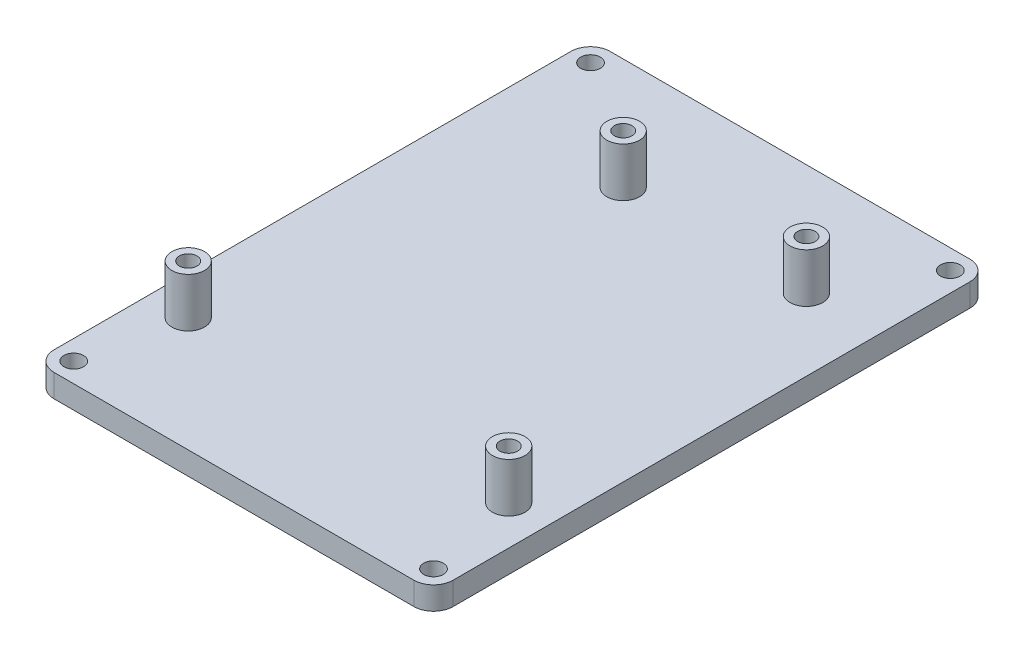
ISO-10303-21;
HEADER;
FILE_DESCRIPTION(('STEP AP214'),'2;1');
FILE_NAME('part.step','',(''),(''),'','','');
FILE_SCHEMA(('AUTOMOTIVE_DESIGN { 1 0 10303 214 1 1 1 1 }'));
ENDSEC;
DATA;
#1=APPLICATION_CONTEXT('core data for automotive mechanical design processes');
#2=APPLICATION_PROTOCOL_DEFINITION('international standard','automotive_design',2000,#1);
#3=PRODUCT_CONTEXT('',#1,'mechanical');
#4=PRODUCT('Part','Part','',(#3));
#5=PRODUCT_RELATED_PRODUCT_CATEGORY('part','',(#4));
#6=PRODUCT_DEFINITION_FORMATION('','',#4);
#7=PRODUCT_DEFINITION_CONTEXT('part definition',#1,'design');
#8=PRODUCT_DEFINITION('design','',#6,#7);
#9=PRODUCT_DEFINITION_SHAPE('','',#8);
#10=(LENGTH_UNIT() NAMED_UNIT(*) SI_UNIT(.MILLI.,.METRE.));
#11=(NAMED_UNIT(*) PLANE_ANGLE_UNIT() SI_UNIT($,.RADIAN.));
#12=(NAMED_UNIT(*) SI_UNIT($,.STERADIAN.) SOLID_ANGLE_UNIT());
#13=UNCERTAINTY_MEASURE_WITH_UNIT(LENGTH_MEASURE(1.E-05),#10,'distance_accuracy_value','');
#14=(GEOMETRIC_REPRESENTATION_CONTEXT(3) GLOBAL_UNCERTAINTY_ASSIGNED_CONTEXT((#13)) GLOBAL_UNIT_ASSIGNED_CONTEXT((#10,
#11,#12)) REPRESENTATION_CONTEXT('',''));
#15=CARTESIAN_POINT('',(0.,0.,0.));
#16=DIRECTION('',(0.,0.,1.));
#17=DIRECTION('',(1.,0.,0.));
#18=AXIS2_PLACEMENT_3D('',#15,#16,#17);
#19=CARTESIAN_POINT('',(30.5,3.5,-42.5));
#20=DIRECTION('',(-1.,0.,0.));
#21=DIRECTION('',(0.,0.,1.));
#22=AXIS2_PLACEMENT_3D('',#19,#20,#21);
#23=PLANE('',#22);
#24=DIRECTION('',(0.,0.,-1.));
#25=VECTOR('',#24,1.);
#26=CARTESIAN_POINT('',(30.5,0.,-42.5));
#27=LINE('',#26,#25);
#28=CARTESIAN_POINT('',(30.5,0.,39.5));
#29=VERTEX_POINT('',#28);
#30=CARTESIAN_POINT('',(30.5,0.,-39.5));
#31=VERTEX_POINT('',#30);
#32=EDGE_CURVE('E128',#29,#31,#27,.T.);
#33=ORIENTED_EDGE('',*,*,#32,.T.);
#34=DIRECTION('',(0.,-1.,0.));
#35=VECTOR('',#34,1.);
#36=CARTESIAN_POINT('',(30.5,3.5,-39.5));
#37=LINE('',#36,#35);
#38=CARTESIAN_POINT('',(30.5,3.5,-39.5));
#39=VERTEX_POINT('',#38);
#40=EDGE_CURVE('E151',#31,#39,#37,.F.);
#41=ORIENTED_EDGE('',*,*,#40,.T.);
#42=DIRECTION('',(0.,0.,-1.));
#43=VECTOR('',#42,1.);
#44=CARTESIAN_POINT('',(30.5,3.5,-42.5));
#45=LINE('',#44,#43);
#46=CARTESIAN_POINT('',(30.5,3.5,39.5));
#47=VERTEX_POINT('',#46);
#48=EDGE_CURVE('E126',#47,#39,#45,.T.);
#49=ORIENTED_EDGE('',*,*,#48,.F.);
#50=DIRECTION('',(0.,-1.,0.));
#51=VECTOR('',#50,1.);
#52=CARTESIAN_POINT('',(30.5,3.5,39.5));
#53=LINE('',#52,#51);
#54=EDGE_CURVE('E148',#47,#29,#53,.T.);
#55=ORIENTED_EDGE('',*,*,#54,.T.);
#56=EDGE_LOOP('',(#33,#41,#49,#55));
#57=FACE_BOUND('',#56,.T.);
#58=ADVANCED_FACE('F33',(#57),#23,.F.);
#59=CARTESIAN_POINT('',(-30.5,3.5,-42.5));
#60=DIRECTION('',(0.,0.,1.));
#61=DIRECTION('',(1.,0.,0.));
#62=AXIS2_PLACEMENT_3D('',#59,#60,#61);
#63=PLANE('',#62);
#64=DIRECTION('',(-1.,0.,0.));
#65=VECTOR('',#64,1.);
#66=CARTESIAN_POINT('',(-30.5,0.,-42.5));
#67=LINE('',#66,#65);
#68=CARTESIAN_POINT('',(27.5,0.,-42.5));
#69=VERTEX_POINT('',#68);
#70=CARTESIAN_POINT('',(-27.5,0.,-42.5));
#71=VERTEX_POINT('',#70);
#72=EDGE_CURVE('E124',#69,#71,#67,.T.);
#73=ORIENTED_EDGE('',*,*,#72,.T.);
#74=DIRECTION('',(0.,-1.,0.));
#75=VECTOR('',#74,1.);
#76=CARTESIAN_POINT('',(-27.5,3.5,-42.5));
#77=LINE('',#76,#75);
#78=CARTESIAN_POINT('',(-27.5,3.5,-42.5));
#79=VERTEX_POINT('',#78);
#80=EDGE_CURVE('E103',#71,#79,#77,.F.);
#81=ORIENTED_EDGE('',*,*,#80,.T.);
#82=DIRECTION('',(-1.,0.,0.));
#83=VECTOR('',#82,1.);
#84=CARTESIAN_POINT('',(-30.5,3.5,-42.5));
#85=LINE('',#84,#83);
#86=CARTESIAN_POINT('',(27.5,3.5,-42.5));
#87=VERTEX_POINT('',#86);
#88=EDGE_CURVE('E167',#87,#79,#85,.T.);
#89=ORIENTED_EDGE('',*,*,#88,.F.);
#90=DIRECTION('',(0.,-1.,0.));
#91=VECTOR('',#90,1.);
#92=CARTESIAN_POINT('',(27.5,3.5,-42.5));
#93=LINE('',#92,#91);
#94=EDGE_CURVE('E108',#87,#69,#93,.T.);
#95=ORIENTED_EDGE('',*,*,#94,.T.);
#96=EDGE_LOOP('',(#73,#81,#89,#95));
#97=FACE_BOUND('',#96,.T.);
#98=ADVANCED_FACE('F291',(#97),#63,.F.);
#99=CARTESIAN_POINT('',(-30.5,3.5,-42.5));
#100=DIRECTION('',(1.,0.,0.));
#101=DIRECTION('',(0.,0.,-1.));
#102=AXIS2_PLACEMENT_3D('',#99,#100,#101);
#103=PLANE('',#102);
#104=DIRECTION('',(0.,0.,1.));
#105=VECTOR('',#104,1.);
#106=CARTESIAN_POINT('',(-30.5,3.5,-42.5));
#107=LINE('',#106,#105);
#108=CARTESIAN_POINT('',(-30.5,3.5,-39.5));
#109=VERTEX_POINT('',#108);
#110=CARTESIAN_POINT('',(-30.5,3.5,39.5));
#111=VERTEX_POINT('',#110);
#112=EDGE_CURVE('E117',#109,#111,#107,.T.);
#113=ORIENTED_EDGE('',*,*,#112,.F.);
#114=DIRECTION('',(0.,-1.,0.));
#115=VECTOR('',#114,1.);
#116=CARTESIAN_POINT('',(-30.5,3.5,-39.5));
#117=LINE('',#116,#115);
#118=CARTESIAN_POINT('',(-30.5,0.,-39.5));
#119=VERTEX_POINT('',#118);
#120=EDGE_CURVE('E102',#109,#119,#117,.T.);
#121=ORIENTED_EDGE('',*,*,#120,.T.);
#122=DIRECTION('',(0.,0.,1.));
#123=VECTOR('',#122,1.);
#124=CARTESIAN_POINT('',(-30.5,0.,-42.5));
#125=LINE('',#124,#123);
#126=CARTESIAN_POINT('',(-30.5,0.,39.5));
#127=VERTEX_POINT('',#126);
#128=EDGE_CURVE('E115',#119,#127,#125,.T.);
#129=ORIENTED_EDGE('',*,*,#128,.T.);
#130=DIRECTION('',(0.,-1.,0.));
#131=VECTOR('',#130,1.);
#132=CARTESIAN_POINT('',(-30.5,3.5,39.5));
#133=LINE('',#132,#131);
#134=EDGE_CURVE('E119',#127,#111,#133,.F.);
#135=ORIENTED_EDGE('',*,*,#134,.T.);
#136=EDGE_LOOP('',(#113,#121,#129,#135));
#137=FACE_BOUND('',#136,.T.);
#138=ADVANCED_FACE('F114',(#137),#103,.F.);
#139=CARTESIAN_POINT('',(-30.5,3.5,42.5));
#140=DIRECTION('',(0.,0.,-1.));
#141=DIRECTION('',(-1.,0.,0.));
#142=AXIS2_PLACEMENT_3D('',#139,#140,#141);
#143=PLANE('',#142);
#144=DIRECTION('',(1.,0.,0.));
#145=VECTOR('',#144,1.);
#146=CARTESIAN_POINT('',(-30.5,0.,42.5));
#147=LINE('',#146,#145);
#148=CARTESIAN_POINT('',(-27.5,0.,42.5));
#149=VERTEX_POINT('',#148);
#150=CARTESIAN_POINT('',(27.5,0.,42.5));
#151=VERTEX_POINT('',#150);
#152=EDGE_CURVE('E123',#149,#151,#147,.T.);
#153=ORIENTED_EDGE('',*,*,#152,.T.);
#154=DIRECTION('',(0.,-1.,0.));
#155=VECTOR('',#154,1.);
#156=CARTESIAN_POINT('',(27.5,3.5,42.5));
#157=LINE('',#156,#155);
#158=CARTESIAN_POINT('',(27.5,3.5,42.5));
#159=VERTEX_POINT('',#158);
#160=EDGE_CURVE('E11',#151,#159,#157,.F.);
#161=ORIENTED_EDGE('',*,*,#160,.T.);
#162=DIRECTION('',(1.,0.,0.));
#163=VECTOR('',#162,1.);
#164=CARTESIAN_POINT('',(-30.5,3.5,42.5));
#165=LINE('',#164,#163);
#166=CARTESIAN_POINT('',(-27.5,3.5,42.5));
#167=VERTEX_POINT('',#166);
#168=EDGE_CURVE('E132',#167,#159,#165,.T.);
#169=ORIENTED_EDGE('',*,*,#168,.F.);
#170=DIRECTION('',(0.,-1.,0.));
#171=VECTOR('',#170,1.);
#172=CARTESIAN_POINT('',(-27.5,3.5,42.5));
#173=LINE('',#172,#171);
#174=EDGE_CURVE('E41',#167,#149,#173,.T.);
#175=ORIENTED_EDGE('',*,*,#174,.T.);
#176=EDGE_LOOP('',(#153,#161,#169,#175));
#177=FACE_BOUND('',#176,.T.);
#178=ADVANCED_FACE('F154',(#177),#143,.F.);
#179=CARTESIAN_POINT('',(0.,3.5,0.));
#180=DIRECTION('',(0.,1.,0.));
#181=DIRECTION('',(0.,0.,1.));
#182=AXIS2_PLACEMENT_3D('',#179,#180,#181);
#183=PLANE('',#182);
#184=CARTESIAN_POINT('',(-8.5,3.5,-25.5));
#185=DIRECTION('',(0.,1.,0.));
#186=DIRECTION('',(0.,0.,1.));
#187=AXIS2_PLACEMENT_3D('',#184,#185,#186);
#188=CIRCLE('',#187,2.5);
#189=CARTESIAN_POINT('',(-8.5,3.5,-23.));
#190=VERTEX_POINT('',#189);
#191=EDGE_CURVE('E219',#190,#190,#188,.T.);
#192=ORIENTED_EDGE('',*,*,#191,.F.);
#193=EDGE_LOOP('',(#192));
#194=FACE_BOUND('',#193,.T.);
#195=CARTESIAN_POINT('',(19.5,3.5,-25.5));
#196=DIRECTION('',(0.,1.,0.));
#197=DIRECTION('',(0.,0.,1.));
#198=AXIS2_PLACEMENT_3D('',#195,#196,#197);
#199=CIRCLE('',#198,2.5);
#200=CARTESIAN_POINT('',(19.5,3.5,-23.));
#201=VERTEX_POINT('',#200);
#202=EDGE_CURVE('E213',#201,#201,#199,.T.);
#203=ORIENTED_EDGE('',*,*,#202,.F.);
#204=EDGE_LOOP('',(#203));
#205=FACE_BOUND('',#204,.T.);
#206=CARTESIAN_POINT('',(24.5,3.5,25.));
#207=DIRECTION('',(0.,1.,0.));
#208=DIRECTION('',(0.,0.,1.));
#209=AXIS2_PLACEMENT_3D('',#206,#207,#208);
#210=CIRCLE('',#209,2.5);
#211=CARTESIAN_POINT('',(24.5,3.5,27.5));
#212=VERTEX_POINT('',#211);
#213=EDGE_CURVE('E207',#212,#212,#210,.T.);
#214=ORIENTED_EDGE('',*,*,#213,.F.);
#215=EDGE_LOOP('',(#214));
#216=FACE_BOUND('',#215,.T.);
#217=CARTESIAN_POINT('',(-24.5,3.5,25.));
#218=DIRECTION('',(0.,1.,0.));
#219=DIRECTION('',(0.,0.,1.));
#220=AXIS2_PLACEMENT_3D('',#217,#218,#219);
#221=CIRCLE('',#220,2.5);
#222=CARTESIAN_POINT('',(-24.5,3.5,27.5));
#223=VERTEX_POINT('',#222);
#224=EDGE_CURVE('E201',#223,#223,#221,.T.);
#225=ORIENTED_EDGE('',*,*,#224,.F.);
#226=EDGE_LOOP('',(#225));
#227=FACE_BOUND('',#226,.T.);
#228=CARTESIAN_POINT('',(27.5,3.5,-39.5));
#229=DIRECTION('',(0.,1.,0.));
#230=DIRECTION('',(0.,0.,1.));
#231=AXIS2_PLACEMENT_3D('',#228,#229,#230);
#232=CIRCLE('',#231,1.5);
#233=CARTESIAN_POINT('',(27.5,3.5,-38.));
#234=VERTEX_POINT('',#233);
#235=EDGE_CURVE('E190',#234,#234,#232,.T.);
#236=ORIENTED_EDGE('',*,*,#235,.F.);
#237=EDGE_LOOP('',(#236));
#238=FACE_BOUND('',#237,.T.);
#239=CARTESIAN_POINT('',(-27.5,3.5,39.5));
#240=DIRECTION('',(0.,1.,0.));
#241=DIRECTION('',(0.,0.,1.));
#242=AXIS2_PLACEMENT_3D('',#239,#240,#241);
#243=CIRCLE('',#242,1.5);
#244=CARTESIAN_POINT('',(-27.5,3.5,41.));
#245=VERTEX_POINT('',#244);
#246=EDGE_CURVE('E183',#245,#245,#243,.T.);
#247=ORIENTED_EDGE('',*,*,#246,.F.);
#248=EDGE_LOOP('',(#247));
#249=FACE_BOUND('',#248,.T.);
#250=CARTESIAN_POINT('',(27.5,3.5,39.5));
#251=DIRECTION('',(0.,1.,0.));
#252=DIRECTION('',(0.,0.,1.));
#253=AXIS2_PLACEMENT_3D('',#250,#251,#252);
#254=CIRCLE('',#253,1.5);
#255=CARTESIAN_POINT('',(27.5,3.5,41.));
#256=VERTEX_POINT('',#255);
#257=EDGE_CURVE('E195',#256,#256,#254,.T.);
#258=ORIENTED_EDGE('',*,*,#257,.F.);
#259=EDGE_LOOP('',(#258));
#260=FACE_BOUND('',#259,.T.);
#261=CARTESIAN_POINT('',(-27.5,3.5,-39.5));
#262=DIRECTION('',(0.,1.,0.));
#263=DIRECTION('',(0.,0.,1.));
#264=AXIS2_PLACEMENT_3D('',#261,#262,#263);
#265=CIRCLE('',#264,1.5);
#266=CARTESIAN_POINT('',(-27.5,3.5,-38.));
#267=VERTEX_POINT('',#266);
#268=EDGE_CURVE('E172',#267,#267,#265,.T.);
#269=ORIENTED_EDGE('',*,*,#268,.F.);
#270=EDGE_LOOP('',(#269));
#271=FACE_BOUND('',#270,.T.);
#272=ORIENTED_EDGE('',*,*,#88,.T.);
#273=CARTESIAN_POINT('',(-27.5,3.5,-39.5));
#274=DIRECTION('',(0.,1.,0.));
#275=DIRECTION('',(0.,0.,1.));
#276=AXIS2_PLACEMENT_3D('',#273,#274,#275);
#277=CIRCLE('',#276,3.);
#278=EDGE_CURVE('E146',#79,#109,#277,.T.);
#279=ORIENTED_EDGE('',*,*,#278,.T.);
#280=ORIENTED_EDGE('',*,*,#112,.T.);
#281=CARTESIAN_POINT('',(-27.5,3.5,39.5));
#282=DIRECTION('',(0.,1.,0.));
#283=DIRECTION('',(0.,0.,1.));
#284=AXIS2_PLACEMENT_3D('',#281,#282,#283);
#285=CIRCLE('',#284,3.);
#286=EDGE_CURVE('E53',#111,#167,#285,.T.);
#287=ORIENTED_EDGE('',*,*,#286,.T.);
#288=ORIENTED_EDGE('',*,*,#168,.T.);
#289=CARTESIAN_POINT('',(27.5,3.5,39.5));
#290=DIRECTION('',(0.,1.,0.));
#291=DIRECTION('',(0.,0.,1.));
#292=AXIS2_PLACEMENT_3D('',#289,#290,#291);
#293=CIRCLE('',#292,3.);
#294=EDGE_CURVE('E142',#159,#47,#293,.T.);
#295=ORIENTED_EDGE('',*,*,#294,.T.);
#296=ORIENTED_EDGE('',*,*,#48,.T.);
#297=CARTESIAN_POINT('',(27.5,3.5,-39.5));
#298=DIRECTION('',(0.,1.,0.));
#299=DIRECTION('',(0.,0.,1.));
#300=AXIS2_PLACEMENT_3D('',#297,#298,#299);
#301=CIRCLE('',#300,3.);
#302=EDGE_CURVE('E144',#39,#87,#301,.T.);
#303=ORIENTED_EDGE('',*,*,#302,.T.);
#304=EDGE_LOOP('',(#272,#279,#280,#287,#288,#295,#296,#303));
#305=FACE_BOUND('',#304,.T.);
#306=ADVANCED_FACE('F272',(#194,#205,#216,#227,#238,#249,#260,#271,#305),#183,.T.);
#307=CARTESIAN_POINT('',(0.,0.,0.));
#308=DIRECTION('',(0.,1.,0.));
#309=DIRECTION('',(0.,0.,1.));
#310=AXIS2_PLACEMENT_3D('',#307,#308,#309);
#311=PLANE('',#310);
#312=CARTESIAN_POINT('',(27.5,0.,-39.5));
#313=DIRECTION('',(0.,1.,0.));
#314=DIRECTION('',(0.,0.,1.));
#315=AXIS2_PLACEMENT_3D('',#312,#313,#314);
#316=CIRCLE('',#315,1.5);
#317=CARTESIAN_POINT('',(27.5,0.,-38.));
#318=VERTEX_POINT('',#317);
#319=EDGE_CURVE('E181',#318,#318,#316,.T.);
#320=ORIENTED_EDGE('',*,*,#319,.T.);
#321=EDGE_LOOP('',(#320));
#322=FACE_BOUND('',#321,.T.);
#323=CARTESIAN_POINT('',(-27.5,0.,39.5));
#324=DIRECTION('',(0.,1.,0.));
#325=DIRECTION('',(0.,0.,1.));
#326=AXIS2_PLACEMENT_3D('',#323,#324,#325);
#327=CIRCLE('',#326,1.5);
#328=CARTESIAN_POINT('',(-27.5,0.,41.));
#329=VERTEX_POINT('',#328);
#330=EDGE_CURVE('E186',#329,#329,#327,.T.);
#331=ORIENTED_EDGE('',*,*,#330,.T.);
#332=EDGE_LOOP('',(#331));
#333=FACE_BOUND('',#332,.T.);
#334=CARTESIAN_POINT('',(27.5,0.,39.5));
#335=DIRECTION('',(0.,1.,0.));
#336=DIRECTION('',(0.,0.,1.));
#337=AXIS2_PLACEMENT_3D('',#334,#335,#336);
#338=CIRCLE('',#337,1.5);
#339=CARTESIAN_POINT('',(27.5,0.,41.));
#340=VERTEX_POINT('',#339);
#341=EDGE_CURVE('E187',#340,#340,#338,.T.);
#342=ORIENTED_EDGE('',*,*,#341,.T.);
#343=EDGE_LOOP('',(#342));
#344=FACE_BOUND('',#343,.T.);
#345=CARTESIAN_POINT('',(-27.5,0.,-39.5));
#346=DIRECTION('',(0.,1.,0.));
#347=DIRECTION('',(0.,0.,1.));
#348=AXIS2_PLACEMENT_3D('',#345,#346,#347);
#349=CIRCLE('',#348,1.5);
#350=CARTESIAN_POINT('',(-27.5,0.,-38.));
#351=VERTEX_POINT('',#350);
#352=EDGE_CURVE('E176',#351,#351,#349,.T.);
#353=ORIENTED_EDGE('',*,*,#352,.T.);
#354=EDGE_LOOP('',(#353));
#355=FACE_BOUND('',#354,.T.);
#356=ORIENTED_EDGE('',*,*,#128,.F.);
#357=CARTESIAN_POINT('',(-27.5,0.,-39.5));
#358=DIRECTION('',(0.,1.,0.));
#359=DIRECTION('',(0.,0.,1.));
#360=AXIS2_PLACEMENT_3D('',#357,#358,#359);
#361=CIRCLE('',#360,3.);
#362=EDGE_CURVE('E98',#119,#71,#361,.F.);
#363=ORIENTED_EDGE('',*,*,#362,.T.);
#364=ORIENTED_EDGE('',*,*,#72,.F.);
#365=CARTESIAN_POINT('',(27.5,0.,-39.5));
#366=DIRECTION('',(0.,1.,0.));
#367=DIRECTION('',(0.,0.,1.));
#368=AXIS2_PLACEMENT_3D('',#365,#366,#367);
#369=CIRCLE('',#368,3.);
#370=EDGE_CURVE('E109',#69,#31,#369,.F.);
#371=ORIENTED_EDGE('',*,*,#370,.T.);
#372=ORIENTED_EDGE('',*,*,#32,.F.);
#373=CARTESIAN_POINT('',(27.5,0.,39.5));
#374=DIRECTION('',(0.,1.,0.));
#375=DIRECTION('',(0.,0.,1.));
#376=AXIS2_PLACEMENT_3D('',#373,#374,#375);
#377=CIRCLE('',#376,3.);
#378=EDGE_CURVE('E135',#29,#151,#377,.F.);
#379=ORIENTED_EDGE('',*,*,#378,.T.);
#380=ORIENTED_EDGE('',*,*,#152,.F.);
#381=CARTESIAN_POINT('',(-27.5,0.,39.5));
#382=DIRECTION('',(0.,1.,0.));
#383=DIRECTION('',(0.,0.,1.));
#384=AXIS2_PLACEMENT_3D('',#381,#382,#383);
#385=CIRCLE('',#384,3.);
#386=EDGE_CURVE('E118',#149,#127,#385,.F.);
#387=ORIENTED_EDGE('',*,*,#386,.T.);
#388=EDGE_LOOP('',(#356,#363,#364,#371,#372,#379,#380,#387));
#389=FACE_BOUND('',#388,.T.);
#390=ADVANCED_FACE('F121',(#322,#333,#344,#355,#389),#311,.F.);
#391=CARTESIAN_POINT('',(-27.5,0.,-39.5));
#392=DIRECTION('',(0.,1.,0.));
#393=DIRECTION('',(0.,0.,1.));
#394=AXIS2_PLACEMENT_3D('',#391,#392,#393);
#395=CYLINDRICAL_SURFACE('',#394,1.5);
#396=ORIENTED_EDGE('',*,*,#352,.F.);
#397=EDGE_LOOP('',(#396));
#398=FACE_BOUND('',#397,.T.);
#399=ORIENTED_EDGE('',*,*,#268,.T.);
#400=EDGE_LOOP('',(#399));
#401=FACE_BOUND('',#400,.T.);
#402=ADVANCED_FACE('F314',(#398,#401),#395,.F.);
#403=CARTESIAN_POINT('',(27.5,0.,39.5));
#404=DIRECTION('',(0.,1.,0.));
#405=DIRECTION('',(0.,0.,1.));
#406=AXIS2_PLACEMENT_3D('',#403,#404,#405);
#407=CYLINDRICAL_SURFACE('',#406,1.5);
#408=ORIENTED_EDGE('',*,*,#341,.F.);
#409=EDGE_LOOP('',(#408));
#410=FACE_BOUND('',#409,.T.);
#411=ORIENTED_EDGE('',*,*,#257,.T.);
#412=EDGE_LOOP('',(#411));
#413=FACE_BOUND('',#412,.T.);
#414=ADVANCED_FACE('F319',(#410,#413),#407,.F.);
#415=CARTESIAN_POINT('',(-27.5,0.,39.5));
#416=DIRECTION('',(0.,1.,0.));
#417=DIRECTION('',(0.,0.,1.));
#418=AXIS2_PLACEMENT_3D('',#415,#416,#417);
#419=CYLINDRICAL_SURFACE('',#418,1.5);
#420=ORIENTED_EDGE('',*,*,#330,.F.);
#421=EDGE_LOOP('',(#420));
#422=FACE_BOUND('',#421,.T.);
#423=ORIENTED_EDGE('',*,*,#246,.T.);
#424=EDGE_LOOP('',(#423));
#425=FACE_BOUND('',#424,.T.);
#426=ADVANCED_FACE('F321',(#422,#425),#419,.F.);
#427=CARTESIAN_POINT('',(27.5,0.,-39.5));
#428=DIRECTION('',(0.,1.,0.));
#429=DIRECTION('',(0.,0.,1.));
#430=AXIS2_PLACEMENT_3D('',#427,#428,#429);
#431=CYLINDRICAL_SURFACE('',#430,1.5);
#432=ORIENTED_EDGE('',*,*,#319,.F.);
#433=EDGE_LOOP('',(#432));
#434=FACE_BOUND('',#433,.T.);
#435=ORIENTED_EDGE('',*,*,#235,.T.);
#436=EDGE_LOOP('',(#435));
#437=FACE_BOUND('',#436,.T.);
#438=ADVANCED_FACE('F324',(#434,#437),#431,.F.);
#439=CARTESIAN_POINT('',(-24.5,11.,25.));
#440=DIRECTION('',(0.,-1.,0.));
#441=DIRECTION('',(0.,0.,-1.));
#442=AXIS2_PLACEMENT_3D('',#439,#440,#441);
#443=CYLINDRICAL_SURFACE('',#442,2.5);
#444=CARTESIAN_POINT('',(-24.5,11.,25.));
#445=DIRECTION('',(0.,1.,0.));
#446=DIRECTION('',(0.,0.,1.));
#447=AXIS2_PLACEMENT_3D('',#444,#445,#446);
#448=CIRCLE('',#447,2.5);
#449=CARTESIAN_POINT('',(-24.5,11.,27.5));
#450=VERTEX_POINT('',#449);
#451=EDGE_CURVE('E198',#450,#450,#448,.T.);
#452=ORIENTED_EDGE('',*,*,#451,.F.);
#453=EDGE_LOOP('',(#452));
#454=FACE_BOUND('',#453,.T.);
#455=ORIENTED_EDGE('',*,*,#224,.T.);
#456=EDGE_LOOP('',(#455));
#457=FACE_BOUND('',#456,.T.);
#458=ADVANCED_FACE('F328',(#454,#457),#443,.T.);
#459=CARTESIAN_POINT('',(-24.5,11.,25.));
#460=DIRECTION('',(0.,1.,0.));
#461=DIRECTION('',(0.,0.,1.));
#462=AXIS2_PLACEMENT_3D('',#459,#460,#461);
#463=PLANE('',#462);
#464=CARTESIAN_POINT('',(-24.5,11.,25.));
#465=DIRECTION('',(0.,1.,0.));
#466=DIRECTION('',(0.,0.,1.));
#467=AXIS2_PLACEMENT_3D('',#464,#465,#466);
#468=CIRCLE('',#467,1.35);
#469=CARTESIAN_POINT('',(-24.5,11.,26.35));
#470=VERTEX_POINT('',#469);
#471=EDGE_CURVE('E237',#470,#470,#468,.T.);
#472=ORIENTED_EDGE('',*,*,#471,.F.);
#473=EDGE_LOOP('',(#472));
#474=FACE_BOUND('',#473,.T.);
#475=ORIENTED_EDGE('',*,*,#451,.T.);
#476=EDGE_LOOP('',(#475));
#477=FACE_BOUND('',#476,.T.);
#478=ADVANCED_FACE('F335',(#474,#477),#463,.T.);
#479=CARTESIAN_POINT('',(24.5,11.,25.));
#480=DIRECTION('',(0.,-1.,0.));
#481=DIRECTION('',(0.,0.,-1.));
#482=AXIS2_PLACEMENT_3D('',#479,#480,#481);
#483=CYLINDRICAL_SURFACE('',#482,2.5);
#484=CARTESIAN_POINT('',(24.5,11.,25.));
#485=DIRECTION('',(0.,1.,0.));
#486=DIRECTION('',(0.,0.,1.));
#487=AXIS2_PLACEMENT_3D('',#484,#485,#486);
#488=CIRCLE('',#487,2.5);
#489=CARTESIAN_POINT('',(24.5,11.,27.5));
#490=VERTEX_POINT('',#489);
#491=EDGE_CURVE('E204',#490,#490,#488,.T.);
#492=ORIENTED_EDGE('',*,*,#491,.F.);
#493=EDGE_LOOP('',(#492));
#494=FACE_BOUND('',#493,.T.);
#495=ORIENTED_EDGE('',*,*,#213,.T.);
#496=EDGE_LOOP('',(#495));
#497=FACE_BOUND('',#496,.T.);
#498=ADVANCED_FACE('F339',(#494,#497),#483,.T.);
#499=CARTESIAN_POINT('',(24.5,11.,25.));
#500=DIRECTION('',(0.,1.,0.));
#501=DIRECTION('',(0.,0.,1.));
#502=AXIS2_PLACEMENT_3D('',#499,#500,#501);
#503=PLANE('',#502);
#504=CARTESIAN_POINT('',(24.5,11.,25.));
#505=DIRECTION('',(0.,1.,0.));
#506=DIRECTION('',(0.,0.,1.));
#507=AXIS2_PLACEMENT_3D('',#504,#505,#506);
#508=CIRCLE('',#507,1.35);
#509=CARTESIAN_POINT('',(24.5,11.,26.35));
#510=VERTEX_POINT('',#509);
#511=EDGE_CURVE('E231',#510,#510,#508,.T.);
#512=ORIENTED_EDGE('',*,*,#511,.F.);
#513=EDGE_LOOP('',(#512));
#514=FACE_BOUND('',#513,.T.);
#515=ORIENTED_EDGE('',*,*,#491,.T.);
#516=EDGE_LOOP('',(#515));
#517=FACE_BOUND('',#516,.T.);
#518=ADVANCED_FACE('F268',(#514,#517),#503,.T.);
#519=CARTESIAN_POINT('',(19.5,11.,-25.5));
#520=DIRECTION('',(0.,-1.,0.));
#521=DIRECTION('',(0.,0.,-1.));
#522=AXIS2_PLACEMENT_3D('',#519,#520,#521);
#523=CYLINDRICAL_SURFACE('',#522,2.5);
#524=CARTESIAN_POINT('',(19.5,11.,-25.5));
#525=DIRECTION('',(0.,1.,0.));
#526=DIRECTION('',(0.,0.,1.));
#527=AXIS2_PLACEMENT_3D('',#524,#525,#526);
#528=CIRCLE('',#527,2.5);
#529=CARTESIAN_POINT('',(19.5,11.,-23.));
#530=VERTEX_POINT('',#529);
#531=EDGE_CURVE('E210',#530,#530,#528,.T.);
#532=ORIENTED_EDGE('',*,*,#531,.F.);
#533=EDGE_LOOP('',(#532));
#534=FACE_BOUND('',#533,.T.);
#535=ORIENTED_EDGE('',*,*,#202,.T.);
#536=EDGE_LOOP('',(#535));
#537=FACE_BOUND('',#536,.T.);
#538=ADVANCED_FACE('F262',(#534,#537),#523,.T.);
#539=CARTESIAN_POINT('',(19.5,11.,-25.5));
#540=DIRECTION('',(0.,1.,0.));
#541=DIRECTION('',(0.,0.,1.));
#542=AXIS2_PLACEMENT_3D('',#539,#540,#541);
#543=PLANE('',#542);
#544=CARTESIAN_POINT('',(19.5,11.,-25.5));
#545=DIRECTION('',(0.,1.,0.));
#546=DIRECTION('',(0.,0.,1.));
#547=AXIS2_PLACEMENT_3D('',#544,#545,#546);
#548=CIRCLE('',#547,1.35);
#549=CARTESIAN_POINT('',(19.5,11.,-24.15));
#550=VERTEX_POINT('',#549);
#551=EDGE_CURVE('E243',#550,#550,#548,.T.);
#552=ORIENTED_EDGE('',*,*,#551,.F.);
#553=EDGE_LOOP('',(#552));
#554=FACE_BOUND('',#553,.T.);
#555=ORIENTED_EDGE('',*,*,#531,.T.);
#556=EDGE_LOOP('',(#555));
#557=FACE_BOUND('',#556,.T.);
#558=ADVANCED_FACE('F258',(#554,#557),#543,.T.);
#559=CARTESIAN_POINT('',(-8.5,11.,-25.5));
#560=DIRECTION('',(0.,-1.,0.));
#561=DIRECTION('',(0.,0.,-1.));
#562=AXIS2_PLACEMENT_3D('',#559,#560,#561);
#563=CYLINDRICAL_SURFACE('',#562,2.5);
#564=CARTESIAN_POINT('',(-8.5,11.,-25.5));
#565=DIRECTION('',(0.,1.,0.));
#566=DIRECTION('',(0.,0.,1.));
#567=AXIS2_PLACEMENT_3D('',#564,#565,#566);
#568=CIRCLE('',#567,2.5);
#569=CARTESIAN_POINT('',(-8.5,11.,-23.));
#570=VERTEX_POINT('',#569);
#571=EDGE_CURVE('E216',#570,#570,#568,.T.);
#572=ORIENTED_EDGE('',*,*,#571,.F.);
#573=EDGE_LOOP('',(#572));
#574=FACE_BOUND('',#573,.T.);
#575=ORIENTED_EDGE('',*,*,#191,.T.);
#576=EDGE_LOOP('',(#575));
#577=FACE_BOUND('',#576,.T.);
#578=ADVANCED_FACE('F261',(#574,#577),#563,.T.);
#579=CARTESIAN_POINT('',(-8.5,11.,-25.5));
#580=DIRECTION('',(0.,1.,0.));
#581=DIRECTION('',(0.,0.,1.));
#582=AXIS2_PLACEMENT_3D('',#579,#580,#581);
#583=PLANE('',#582);
#584=CARTESIAN_POINT('',(-8.5,11.,-25.5));
#585=DIRECTION('',(0.,1.,0.));
#586=DIRECTION('',(0.,0.,1.));
#587=AXIS2_PLACEMENT_3D('',#584,#585,#586);
#588=CIRCLE('',#587,1.35);
#589=CARTESIAN_POINT('',(-8.5,11.,-24.15));
#590=VERTEX_POINT('',#589);
#591=EDGE_CURVE('E225',#590,#590,#588,.T.);
#592=ORIENTED_EDGE('',*,*,#591,.F.);
#593=EDGE_LOOP('',(#592));
#594=FACE_BOUND('',#593,.T.);
#595=ORIENTED_EDGE('',*,*,#571,.T.);
#596=EDGE_LOOP('',(#595));
#597=FACE_BOUND('',#596,.T.);
#598=ADVANCED_FACE('F349',(#594,#597),#583,.T.);
#599=CARTESIAN_POINT('',(-8.5,3.5,-25.5));
#600=DIRECTION('',(0.,1.,0.));
#601=DIRECTION('',(0.,0.,1.));
#602=AXIS2_PLACEMENT_3D('',#599,#600,#601);
#603=CYLINDRICAL_SURFACE('',#602,1.35);
#604=CARTESIAN_POINT('',(-8.5,3.5,-25.5));
#605=DIRECTION('',(0.,1.,0.));
#606=DIRECTION('',(0.,0.,1.));
#607=AXIS2_PLACEMENT_3D('',#604,#605,#606);
#608=CIRCLE('',#607,1.35);
#609=CARTESIAN_POINT('',(-8.5,3.5,-24.15));
#610=VERTEX_POINT('',#609);
#611=EDGE_CURVE('E222',#610,#610,#608,.T.);
#612=ORIENTED_EDGE('',*,*,#611,.F.);
#613=EDGE_LOOP('',(#612));
#614=FACE_BOUND('',#613,.T.);
#615=ORIENTED_EDGE('',*,*,#591,.T.);
#616=EDGE_LOOP('',(#615));
#617=FACE_BOUND('',#616,.T.);
#618=ADVANCED_FACE('F353',(#614,#617),#603,.F.);
#619=CARTESIAN_POINT('',(-8.5,3.5,-25.5));
#620=DIRECTION('',(0.,1.,0.));
#621=DIRECTION('',(0.,0.,1.));
#622=AXIS2_PLACEMENT_3D('',#619,#620,#621);
#623=PLANE('',#622);
#624=ORIENTED_EDGE('',*,*,#611,.T.);
#625=EDGE_LOOP('',(#624));
#626=FACE_BOUND('',#625,.T.);
#627=ADVANCED_FACE('F254',(#626),#623,.T.);
#628=CARTESIAN_POINT('',(19.5,3.5,-25.5));
#629=DIRECTION('',(0.,1.,0.));
#630=DIRECTION('',(0.,0.,1.));
#631=AXIS2_PLACEMENT_3D('',#628,#629,#630);
#632=CYLINDRICAL_SURFACE('',#631,1.35);
#633=CARTESIAN_POINT('',(19.5,3.5,-25.5));
#634=DIRECTION('',(0.,1.,0.));
#635=DIRECTION('',(0.,0.,1.));
#636=AXIS2_PLACEMENT_3D('',#633,#634,#635);
#637=CIRCLE('',#636,1.35);
#638=CARTESIAN_POINT('',(19.5,3.5,-24.15));
#639=VERTEX_POINT('',#638);
#640=EDGE_CURVE('E228',#639,#639,#637,.T.);
#641=ORIENTED_EDGE('',*,*,#640,.F.);
#642=EDGE_LOOP('',(#641));
#643=FACE_BOUND('',#642,.T.);
#644=ORIENTED_EDGE('',*,*,#551,.T.);
#645=EDGE_LOOP('',(#644));
#646=FACE_BOUND('',#645,.T.);
#647=ADVANCED_FACE('F251',(#643,#646),#632,.F.);
#648=CARTESIAN_POINT('',(19.5,3.5,-25.5));
#649=DIRECTION('',(0.,1.,0.));
#650=DIRECTION('',(0.,0.,1.));
#651=AXIS2_PLACEMENT_3D('',#648,#649,#650);
#652=PLANE('',#651);
#653=ORIENTED_EDGE('',*,*,#640,.T.);
#654=EDGE_LOOP('',(#653));
#655=FACE_BOUND('',#654,.T.);
#656=ADVANCED_FACE('F249',(#655),#652,.T.);
#657=CARTESIAN_POINT('',(24.5,3.5,25.));
#658=DIRECTION('',(0.,1.,0.));
#659=DIRECTION('',(0.,0.,1.));
#660=AXIS2_PLACEMENT_3D('',#657,#658,#659);
#661=CYLINDRICAL_SURFACE('',#660,1.35);
#662=CARTESIAN_POINT('',(24.5,3.5,25.));
#663=DIRECTION('',(0.,1.,0.));
#664=DIRECTION('',(0.,0.,1.));
#665=AXIS2_PLACEMENT_3D('',#662,#663,#664);
#666=CIRCLE('',#665,1.35);
#667=CARTESIAN_POINT('',(24.5,3.5,26.35));
#668=VERTEX_POINT('',#667);
#669=EDGE_CURVE('E234',#668,#668,#666,.T.);
#670=ORIENTED_EDGE('',*,*,#669,.F.);
#671=EDGE_LOOP('',(#670));
#672=FACE_BOUND('',#671,.T.);
#673=ORIENTED_EDGE('',*,*,#511,.T.);
#674=EDGE_LOOP('',(#673));
#675=FACE_BOUND('',#674,.T.);
#676=ADVANCED_FACE('F361',(#672,#675),#661,.F.);
#677=CARTESIAN_POINT('',(24.5,3.5,25.));
#678=DIRECTION('',(0.,1.,0.));
#679=DIRECTION('',(0.,0.,1.));
#680=AXIS2_PLACEMENT_3D('',#677,#678,#679);
#681=PLANE('',#680);
#682=ORIENTED_EDGE('',*,*,#669,.T.);
#683=EDGE_LOOP('',(#682));
#684=FACE_BOUND('',#683,.T.);
#685=ADVANCED_FACE('F364',(#684),#681,.T.);
#686=CARTESIAN_POINT('',(-24.5,3.5,25.));
#687=DIRECTION('',(0.,1.,0.));
#688=DIRECTION('',(0.,0.,1.));
#689=AXIS2_PLACEMENT_3D('',#686,#687,#688);
#690=CYLINDRICAL_SURFACE('',#689,1.35);
#691=CARTESIAN_POINT('',(-24.5,3.5,25.));
#692=DIRECTION('',(0.,1.,0.));
#693=DIRECTION('',(0.,0.,1.));
#694=AXIS2_PLACEMENT_3D('',#691,#692,#693);
#695=CIRCLE('',#694,1.35);
#696=CARTESIAN_POINT('',(-24.5,3.5,26.35));
#697=VERTEX_POINT('',#696);
#698=EDGE_CURVE('E240',#697,#697,#695,.T.);
#699=ORIENTED_EDGE('',*,*,#698,.F.);
#700=EDGE_LOOP('',(#699));
#701=FACE_BOUND('',#700,.T.);
#702=ORIENTED_EDGE('',*,*,#471,.T.);
#703=EDGE_LOOP('',(#702));
#704=FACE_BOUND('',#703,.T.);
#705=ADVANCED_FACE('F368',(#701,#704),#690,.F.);
#706=CARTESIAN_POINT('',(-24.5,3.5,25.));
#707=DIRECTION('',(0.,1.,0.));
#708=DIRECTION('',(0.,0.,1.));
#709=AXIS2_PLACEMENT_3D('',#706,#707,#708);
#710=PLANE('',#709);
#711=ORIENTED_EDGE('',*,*,#698,.T.);
#712=EDGE_LOOP('',(#711));
#713=FACE_BOUND('',#712,.T.);
#714=ADVANCED_FACE('F300',(#713),#710,.T.);
#715=CARTESIAN_POINT('',(-27.5,3.5,-39.5));
#716=DIRECTION('',(0.,-1.,0.));
#717=DIRECTION('',(0.,0.,-1.));
#718=AXIS2_PLACEMENT_3D('',#715,#716,#717);
#719=CYLINDRICAL_SURFACE('',#718,3.);
#720=ORIENTED_EDGE('',*,*,#278,.F.);
#721=ORIENTED_EDGE('',*,*,#80,.F.);
#722=ORIENTED_EDGE('',*,*,#362,.F.);
#723=ORIENTED_EDGE('',*,*,#120,.F.);
#724=EDGE_LOOP('',(#720,#721,#722,#723));
#725=FACE_BOUND('',#724,.T.);
#726=ADVANCED_FACE('F101',(#725),#719,.T.);
#727=CARTESIAN_POINT('',(27.5,3.5,-39.5));
#728=DIRECTION('',(0.,-1.,0.));
#729=DIRECTION('',(0.,0.,-1.));
#730=AXIS2_PLACEMENT_3D('',#727,#728,#729);
#731=CYLINDRICAL_SURFACE('',#730,3.);
#732=ORIENTED_EDGE('',*,*,#302,.F.);
#733=ORIENTED_EDGE('',*,*,#40,.F.);
#734=ORIENTED_EDGE('',*,*,#370,.F.);
#735=ORIENTED_EDGE('',*,*,#94,.F.);
#736=EDGE_LOOP('',(#732,#733,#734,#735));
#737=FACE_BOUND('',#736,.T.);
#738=ADVANCED_FACE('F293',(#737),#731,.T.);
#739=CARTESIAN_POINT('',(27.5,3.5,39.5));
#740=DIRECTION('',(0.,-1.,0.));
#741=DIRECTION('',(0.,0.,-1.));
#742=AXIS2_PLACEMENT_3D('',#739,#740,#741);
#743=CYLINDRICAL_SURFACE('',#742,3.);
#744=ORIENTED_EDGE('',*,*,#294,.F.);
#745=ORIENTED_EDGE('',*,*,#160,.F.);
#746=ORIENTED_EDGE('',*,*,#378,.F.);
#747=ORIENTED_EDGE('',*,*,#54,.F.);
#748=EDGE_LOOP('',(#744,#745,#746,#747));
#749=FACE_BOUND('',#748,.T.);
#750=ADVANCED_FACE('F161',(#749),#743,.T.);
#751=CARTESIAN_POINT('',(-27.5,3.5,39.5));
#752=DIRECTION('',(0.,-1.,0.));
#753=DIRECTION('',(0.,0.,-1.));
#754=AXIS2_PLACEMENT_3D('',#751,#752,#753);
#755=CYLINDRICAL_SURFACE('',#754,3.);
#756=ORIENTED_EDGE('',*,*,#286,.F.);
#757=ORIENTED_EDGE('',*,*,#134,.F.);
#758=ORIENTED_EDGE('',*,*,#386,.F.);
#759=ORIENTED_EDGE('',*,*,#174,.F.);
#760=EDGE_LOOP('',(#756,#757,#758,#759));
#761=FACE_BOUND('',#760,.T.);
#762=ADVANCED_FACE('F35',(#761),#755,.T.);
#763=CLOSED_SHELL('',(#58,#98,#138,#178,#306,#390,#402,#414,#426,#438,#458,#478,#498,#518,#538,
#558,#578,#598,#618,#627,#647,#656,#676,#685,#705,#714,#726,#738,#750,#762));
#764=MANIFOLD_SOLID_BREP('B2',#763);
#765=ADVANCED_BREP_SHAPE_REPRESENTATION('',(#18,#764),#14);
#766=SHAPE_DEFINITION_REPRESENTATION(#9,#765);
ENDSEC;
END-ISO-10303-21;
